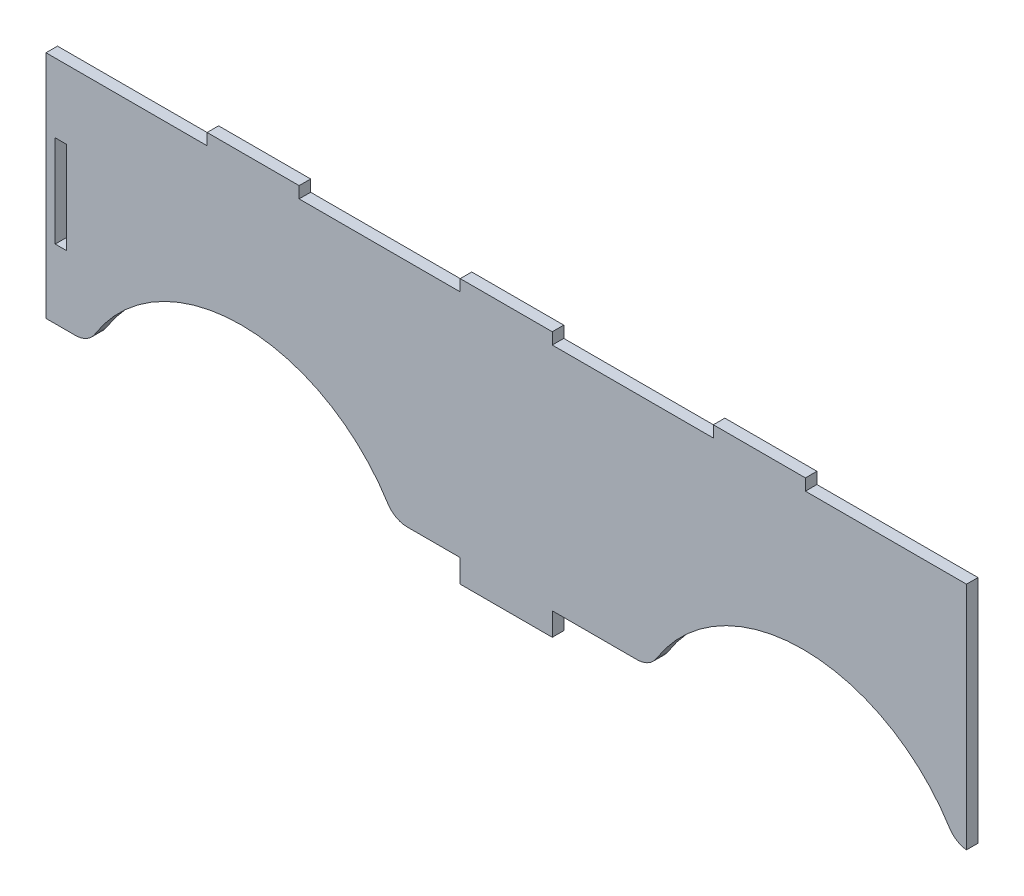
ISO-10303-21;
HEADER;
FILE_DESCRIPTION(('STEP AP214'),'2;1');
FILE_NAME('part.step','',(''),(''),'','','');
FILE_SCHEMA(('AUTOMOTIVE_DESIGN { 1 0 10303 214 1 1 1 1 }'));
ENDSEC;
DATA;
#1=APPLICATION_CONTEXT('core data for automotive mechanical design processes');
#2=APPLICATION_PROTOCOL_DEFINITION('international standard','automotive_design',2000,#1);
#3=PRODUCT_CONTEXT('',#1,'mechanical');
#4=PRODUCT('Part','Part','',(#3));
#5=PRODUCT_RELATED_PRODUCT_CATEGORY('part','',(#4));
#6=PRODUCT_DEFINITION_FORMATION('','',#4);
#7=PRODUCT_DEFINITION_CONTEXT('part definition',#1,'design');
#8=PRODUCT_DEFINITION('design','',#6,#7);
#9=PRODUCT_DEFINITION_SHAPE('','',#8);
#10=(LENGTH_UNIT() NAMED_UNIT(*) SI_UNIT(.MILLI.,.METRE.));
#11=(NAMED_UNIT(*) PLANE_ANGLE_UNIT() SI_UNIT($,.RADIAN.));
#12=(NAMED_UNIT(*) SI_UNIT($,.STERADIAN.) SOLID_ANGLE_UNIT());
#13=UNCERTAINTY_MEASURE_WITH_UNIT(LENGTH_MEASURE(1.E-05),#10,'distance_accuracy_value','');
#14=(GEOMETRIC_REPRESENTATION_CONTEXT(3) GLOBAL_UNCERTAINTY_ASSIGNED_CONTEXT((#13)) GLOBAL_UNIT_ASSIGNED_CONTEXT((#10,
#11,#12)) REPRESENTATION_CONTEXT('',''));
#15=CARTESIAN_POINT('',(0.,0.,0.));
#16=DIRECTION('',(0.,0.,1.));
#17=DIRECTION('',(1.,0.,0.));
#18=AXIS2_PLACEMENT_3D('',#15,#16,#17);
#19=CARTESIAN_POINT('',(64.453752096446,-42.5,1.25));
#20=DIRECTION('',(0.,0.,-1.));
#21=DIRECTION('',(-1.,0.,0.));
#22=AXIS2_PLACEMENT_3D('',#19,#20,#21);
#23=PLANE('',#22);
#24=CARTESIAN_POINT('',(64.453752096446,-42.5,1.25));
#25=DIRECTION('',(0.,0.,-1.));
#26=DIRECTION('',(-1.,0.,0.));
#27=AXIS2_PLACEMENT_3D('',#24,#25,#26);
#28=CIRCLE('',#27,37.5);
#29=CARTESIAN_POINT('',(32.6400643717638,-22.6470588235294,1.25));
#30=VERTEX_POINT('',#29);
#31=CARTESIAN_POINT('',(96.282738613422,-22.6715956945053,1.25));
#32=VERTEX_POINT('',#31);
#33=EDGE_CURVE('E296',#30,#32,#28,.T.);
#34=ORIENTED_EDGE('',*,*,#33,.T.);
#35=CARTESIAN_POINT('',(100.526603482352,-20.0278084537727,1.25));
#36=DIRECTION('',(0.,0.,-1.));
#37=DIRECTION('',(-1.,0.,0.));
#38=AXIS2_PLACEMENT_3D('',#35,#36,#37);
#39=CIRCLE('',#38,5.);
#40=CARTESIAN_POINT('',(100.,-25.,1.25));
#41=VERTEX_POINT('',#40);
#42=EDGE_CURVE('E454',#32,#41,#39,.F.);
#43=ORIENTED_EDGE('',*,*,#42,.T.);
#44=DIRECTION('',(0.,1.,0.));
#45=VECTOR('',#44,1.);
#46=CARTESIAN_POINT('',(100.,-25.,1.25));
#47=LINE('',#46,#45);
#48=CARTESIAN_POINT('',(100.,25.,1.25));
#49=VERTEX_POINT('',#48);
#50=EDGE_CURVE('E299',#41,#49,#47,.T.);
#51=ORIENTED_EDGE('',*,*,#50,.T.);
#52=DIRECTION('',(-1.,0.,0.));
#53=VECTOR('',#52,1.);
#54=CARTESIAN_POINT('',(100.,25.,1.25));
#55=LINE('',#54,#53);
#56=CARTESIAN_POINT('',(65.,25.,1.25));
#57=VERTEX_POINT('',#56);
#58=EDGE_CURVE('E301',#49,#57,#55,.T.);
#59=ORIENTED_EDGE('',*,*,#58,.T.);
#60=DIRECTION('',(0.,1.,0.));
#61=VECTOR('',#60,1.);
#62=CARTESIAN_POINT('',(65.,25.,1.25));
#63=LINE('',#62,#61);
#64=CARTESIAN_POINT('',(65.,27.5,1.25));
#65=VERTEX_POINT('',#64);
#66=EDGE_CURVE('E303',#57,#65,#63,.T.);
#67=ORIENTED_EDGE('',*,*,#66,.T.);
#68=DIRECTION('',(-1.,0.,0.));
#69=VECTOR('',#68,1.);
#70=CARTESIAN_POINT('',(65.,27.5,1.25));
#71=LINE('',#70,#69);
#72=CARTESIAN_POINT('',(45.,27.5,1.25));
#73=VERTEX_POINT('',#72);
#74=EDGE_CURVE('E305',#65,#73,#71,.T.);
#75=ORIENTED_EDGE('',*,*,#74,.T.);
#76=DIRECTION('',(0.,-1.,0.));
#77=VECTOR('',#76,1.);
#78=CARTESIAN_POINT('',(45.,27.5,1.25));
#79=LINE('',#78,#77);
#80=CARTESIAN_POINT('',(45.,25.,1.25));
#81=VERTEX_POINT('',#80);
#82=EDGE_CURVE('E307',#73,#81,#79,.T.);
#83=ORIENTED_EDGE('',*,*,#82,.T.);
#84=DIRECTION('',(-1.,0.,0.));
#85=VECTOR('',#84,1.);
#86=CARTESIAN_POINT('',(45.,25.,1.25));
#87=LINE('',#86,#85);
#88=CARTESIAN_POINT('',(9.99999999999998,25.,1.25));
#89=VERTEX_POINT('',#88);
#90=EDGE_CURVE('E309',#81,#89,#87,.T.);
#91=ORIENTED_EDGE('',*,*,#90,.T.);
#92=DIRECTION('',(0.,1.,0.));
#93=VECTOR('',#92,1.);
#94=CARTESIAN_POINT('',(9.99999999999998,25.,1.25));
#95=LINE('',#94,#93);
#96=CARTESIAN_POINT('',(10.,27.5,1.25));
#97=VERTEX_POINT('',#96);
#98=EDGE_CURVE('E311',#89,#97,#95,.T.);
#99=ORIENTED_EDGE('',*,*,#98,.T.);
#100=DIRECTION('',(-1.,0.,0.));
#101=VECTOR('',#100,1.);
#102=CARTESIAN_POINT('',(-10.,27.5,1.25));
#103=LINE('',#102,#101);
#104=CARTESIAN_POINT('',(-10.,27.5,1.25));
#105=VERTEX_POINT('',#104);
#106=EDGE_CURVE('E313',#97,#105,#103,.T.);
#107=ORIENTED_EDGE('',*,*,#106,.T.);
#108=DIRECTION('',(0.,-1.,0.));
#109=VECTOR('',#108,1.);
#110=CARTESIAN_POINT('',(-9.99999999999998,25.,1.25));
#111=LINE('',#110,#109);
#112=CARTESIAN_POINT('',(-9.99999999999998,25.,1.25));
#113=VERTEX_POINT('',#112);
#114=EDGE_CURVE('E315',#105,#113,#111,.T.);
#115=ORIENTED_EDGE('',*,*,#114,.T.);
#116=DIRECTION('',(-1.,0.,0.));
#117=VECTOR('',#116,1.);
#118=CARTESIAN_POINT('',(-45.,25.,1.25));
#119=LINE('',#118,#117);
#120=CARTESIAN_POINT('',(-45.,25.,1.25));
#121=VERTEX_POINT('',#120);
#122=EDGE_CURVE('E317',#113,#121,#119,.T.);
#123=ORIENTED_EDGE('',*,*,#122,.T.);
#124=DIRECTION('',(0.,1.,0.));
#125=VECTOR('',#124,1.);
#126=CARTESIAN_POINT('',(-45.,27.5,1.25));
#127=LINE('',#126,#125);
#128=CARTESIAN_POINT('',(-45.,27.5,1.25));
#129=VERTEX_POINT('',#128);
#130=EDGE_CURVE('E319',#121,#129,#127,.T.);
#131=ORIENTED_EDGE('',*,*,#130,.T.);
#132=DIRECTION('',(-1.,0.,0.));
#133=VECTOR('',#132,1.);
#134=CARTESIAN_POINT('',(-65.,27.5,1.25));
#135=LINE('',#134,#133);
#136=CARTESIAN_POINT('',(-65.,27.5,1.25));
#137=VERTEX_POINT('',#136);
#138=EDGE_CURVE('E321',#129,#137,#135,.T.);
#139=ORIENTED_EDGE('',*,*,#138,.T.);
#140=DIRECTION('',(0.,-1.,0.));
#141=VECTOR('',#140,1.);
#142=CARTESIAN_POINT('',(-65.,25.,1.25));
#143=LINE('',#142,#141);
#144=CARTESIAN_POINT('',(-65.,25.,1.25));
#145=VERTEX_POINT('',#144);
#146=EDGE_CURVE('E323',#137,#145,#143,.T.);
#147=ORIENTED_EDGE('',*,*,#146,.T.);
#148=DIRECTION('',(-1.,0.,0.));
#149=VECTOR('',#148,1.);
#150=CARTESIAN_POINT('',(-100.,25.,1.25));
#151=LINE('',#150,#149);
#152=CARTESIAN_POINT('',(-100.,25.,1.25));
#153=VERTEX_POINT('',#152);
#154=EDGE_CURVE('E325',#145,#153,#151,.T.);
#155=ORIENTED_EDGE('',*,*,#154,.T.);
#156=DIRECTION('',(0.,-1.,0.));
#157=VECTOR('',#156,1.);
#158=CARTESIAN_POINT('',(-100.,-25.,1.25));
#159=LINE('',#158,#157);
#160=CARTESIAN_POINT('',(-100.,-25.,1.25));
#161=VERTEX_POINT('',#160);
#162=EDGE_CURVE('E327',#153,#161,#159,.T.);
#163=ORIENTED_EDGE('',*,*,#162,.T.);
#164=DIRECTION('',(1.,0.,0.));
#165=VECTOR('',#164,1.);
#166=CARTESIAN_POINT('',(-90.74,-25.,1.25));
#167=LINE('',#166,#165);
#168=CARTESIAN_POINT('',(-93.6292648510859,-25.,1.25));
#169=VERTEX_POINT('',#168);
#170=EDGE_CURVE('E280',#161,#169,#167,.T.);
#171=ORIENTED_EDGE('',*,*,#170,.T.);
#172=CARTESIAN_POINT('',(-93.6292648510859,-20.,1.25));
#173=DIRECTION('',(0.,0.,-1.));
#174=DIRECTION('',(-1.,0.,0.));
#175=AXIS2_PLACEMENT_3D('',#172,#173,#174);
#176=CIRCLE('',#175,5.);
#177=CARTESIAN_POINT('',(-89.3874398211283,-22.6470588235294,1.25));
#178=VERTEX_POINT('',#177);
#179=EDGE_CURVE('E449',#169,#178,#176,.F.);
#180=ORIENTED_EDGE('',*,*,#179,.T.);
#181=CARTESIAN_POINT('',(-57.573752096446,-42.5,1.25));
#182=DIRECTION('',(0.,0.,-1.));
#183=DIRECTION('',(-1.,0.,0.));
#184=AXIS2_PLACEMENT_3D('',#181,#182,#183);
#185=CIRCLE('',#184,37.5);
#186=CARTESIAN_POINT('',(-25.7600643717638,-22.6470588235294,1.25));
#187=VERTEX_POINT('',#186);
#188=EDGE_CURVE('E283',#178,#187,#185,.T.);
#189=ORIENTED_EDGE('',*,*,#188,.T.);
#190=CARTESIAN_POINT('',(-21.5182393418061,-20.,1.25));
#191=DIRECTION('',(0.,0.,-1.));
#192=DIRECTION('',(-1.,0.,0.));
#193=AXIS2_PLACEMENT_3D('',#190,#191,#192);
#194=CIRCLE('',#193,5.);
#195=CARTESIAN_POINT('',(-21.5182393418061,-25.,1.25));
#196=VERTEX_POINT('',#195);
#197=EDGE_CURVE('E56',#187,#196,#194,.F.);
#198=ORIENTED_EDGE('',*,*,#197,.T.);
#199=DIRECTION('',(1.,0.,0.));
#200=VECTOR('',#199,1.);
#201=CARTESIAN_POINT('',(-10.,-25.,1.25));
#202=LINE('',#201,#200);
#203=CARTESIAN_POINT('',(-10.,-25.,1.25));
#204=VERTEX_POINT('',#203);
#205=EDGE_CURVE('E286',#196,#204,#202,.T.);
#206=ORIENTED_EDGE('',*,*,#205,.T.);
#207=DIRECTION('',(0.,-1.,0.));
#208=VECTOR('',#207,1.);
#209=CARTESIAN_POINT('',(-10.,-25.,1.25));
#210=LINE('',#209,#208);
#211=CARTESIAN_POINT('',(-10.,-30.,1.25));
#212=VERTEX_POINT('',#211);
#213=EDGE_CURVE('E288',#204,#212,#210,.T.);
#214=ORIENTED_EDGE('',*,*,#213,.T.);
#215=DIRECTION('',(1.,0.,0.));
#216=VECTOR('',#215,1.);
#217=CARTESIAN_POINT('',(-10.,-30.,1.25));
#218=LINE('',#217,#216);
#219=CARTESIAN_POINT('',(10.,-30.,1.25));
#220=VERTEX_POINT('',#219);
#221=EDGE_CURVE('E290',#212,#220,#218,.T.);
#222=ORIENTED_EDGE('',*,*,#221,.T.);
#223=DIRECTION('',(0.,1.,0.));
#224=VECTOR('',#223,1.);
#225=CARTESIAN_POINT('',(10.,-30.,1.25));
#226=LINE('',#225,#224);
#227=CARTESIAN_POINT('',(10.,-25.,1.25));
#228=VERTEX_POINT('',#227);
#229=EDGE_CURVE('E292',#220,#228,#226,.T.);
#230=ORIENTED_EDGE('',*,*,#229,.T.);
#231=DIRECTION('',(1.,0.,0.));
#232=VECTOR('',#231,1.);
#233=CARTESIAN_POINT('',(31.287504192892,-25.,1.25));
#234=LINE('',#233,#232);
#235=CARTESIAN_POINT('',(28.3982393418061,-25.,1.25));
#236=VERTEX_POINT('',#235);
#237=EDGE_CURVE('E294',#228,#236,#234,.T.);
#238=ORIENTED_EDGE('',*,*,#237,.T.);
#239=CARTESIAN_POINT('',(28.3982393418061,-20.,1.25));
#240=DIRECTION('',(0.,0.,-1.));
#241=DIRECTION('',(-1.,0.,0.));
#242=AXIS2_PLACEMENT_3D('',#239,#240,#241);
#243=CIRCLE('',#242,5.);
#244=EDGE_CURVE('E452',#236,#30,#243,.F.);
#245=ORIENTED_EDGE('',*,*,#244,.T.);
#246=EDGE_LOOP('',(#34,#43,#51,#59,#67,#75,#83,#91,#99,#107,#115,#123,#131,#139,#147,#155,#163,
#171,#180,#189,#198,#206,#214,#222,#230,#238,#245));
#247=FACE_BOUND('',#246,.T.);
#248=DIRECTION('',(0.,1.,0.));
#249=VECTOR('',#248,1.);
#250=CARTESIAN_POINT('',(-95.5,-10.,1.25));
#251=LINE('',#250,#249);
#252=CARTESIAN_POINT('',(-95.5,-10.,1.25));
#253=VERTEX_POINT('',#252);
#254=CARTESIAN_POINT('',(-95.5,10.,1.25));
#255=VERTEX_POINT('',#254);
#256=EDGE_CURVE('E239',#253,#255,#251,.T.);
#257=ORIENTED_EDGE('',*,*,#256,.F.);
#258=DIRECTION('',(1.,0.,0.));
#259=VECTOR('',#258,1.);
#260=CARTESIAN_POINT('',(-98.,-10.,1.25));
#261=LINE('',#260,#259);
#262=CARTESIAN_POINT('',(-98.,-9.99999999999999,1.25));
#263=VERTEX_POINT('',#262);
#264=EDGE_CURVE('E264',#263,#253,#261,.T.);
#265=ORIENTED_EDGE('',*,*,#264,.F.);
#266=DIRECTION('',(0.,-1.,0.));
#267=VECTOR('',#266,1.);
#268=CARTESIAN_POINT('',(-98.,-10.,1.25));
#269=LINE('',#268,#267);
#270=CARTESIAN_POINT('',(-98.,10.,1.25));
#271=VERTEX_POINT('',#270);
#272=EDGE_CURVE('E262',#271,#263,#269,.T.);
#273=ORIENTED_EDGE('',*,*,#272,.F.);
#274=DIRECTION('',(-1.,0.,0.));
#275=VECTOR('',#274,1.);
#276=CARTESIAN_POINT('',(-98.,10.,1.25));
#277=LINE('',#276,#275);
#278=EDGE_CURVE('E249',#255,#271,#277,.T.);
#279=ORIENTED_EDGE('',*,*,#278,.F.);
#280=EDGE_LOOP('',(#257,#265,#273,#279));
#281=FACE_BOUND('',#280,.T.);
#282=ADVANCED_FACE('F33',(#247,#281),#23,.F.);
#283=CARTESIAN_POINT('',(64.453752096446,-42.5,-1.25));
#284=DIRECTION('',(0.,0.,-1.));
#285=DIRECTION('',(-1.,0.,0.));
#286=AXIS2_PLACEMENT_3D('',#283,#284,#285);
#287=PLANE('',#286);
#288=DIRECTION('',(0.,1.,0.));
#289=VECTOR('',#288,1.);
#290=CARTESIAN_POINT('',(100.,-25.,-1.25));
#291=LINE('',#290,#289);
#292=CARTESIAN_POINT('',(100.,-25.,-1.25));
#293=VERTEX_POINT('',#292);
#294=CARTESIAN_POINT('',(100.,25.,-1.25));
#295=VERTEX_POINT('',#294);
#296=EDGE_CURVE('E348',#293,#295,#291,.T.);
#297=ORIENTED_EDGE('',*,*,#296,.F.);
#298=CARTESIAN_POINT('',(100.526603482352,-20.0278084537727,-1.25));
#299=DIRECTION('',(0.,0.,-1.));
#300=DIRECTION('',(-1.,0.,0.));
#301=AXIS2_PLACEMENT_3D('',#298,#299,#300);
#302=CIRCLE('',#301,5.);
#303=CARTESIAN_POINT('',(96.282738613422,-22.6715956945053,-1.25));
#304=VERTEX_POINT('',#303);
#305=EDGE_CURVE('E442',#293,#304,#302,.T.);
#306=ORIENTED_EDGE('',*,*,#305,.T.);
#307=CARTESIAN_POINT('',(64.453752096446,-42.5,-1.25));
#308=DIRECTION('',(0.,0.,-1.));
#309=DIRECTION('',(-1.,0.,0.));
#310=AXIS2_PLACEMENT_3D('',#307,#308,#309);
#311=CIRCLE('',#310,37.5);
#312=CARTESIAN_POINT('',(32.6400643717638,-22.6470588235294,-1.25));
#313=VERTEX_POINT('',#312);
#314=EDGE_CURVE('E345',#313,#304,#311,.T.);
#315=ORIENTED_EDGE('',*,*,#314,.F.);
#316=CARTESIAN_POINT('',(28.3982393418061,-20.,-1.25));
#317=DIRECTION('',(0.,0.,-1.));
#318=DIRECTION('',(-1.,0.,0.));
#319=AXIS2_PLACEMENT_3D('',#316,#317,#318);
#320=CIRCLE('',#319,5.);
#321=CARTESIAN_POINT('',(28.3982393418061,-25.,-1.25));
#322=VERTEX_POINT('',#321);
#323=EDGE_CURVE('E440',#313,#322,#320,.T.);
#324=ORIENTED_EDGE('',*,*,#323,.T.);
#325=DIRECTION('',(1.,0.,0.));
#326=VECTOR('',#325,1.);
#327=CARTESIAN_POINT('',(31.287504192892,-25.,-1.25));
#328=LINE('',#327,#326);
#329=CARTESIAN_POINT('',(10.,-25.,-1.25));
#330=VERTEX_POINT('',#329);
#331=EDGE_CURVE('E343',#330,#322,#328,.T.);
#332=ORIENTED_EDGE('',*,*,#331,.F.);
#333=DIRECTION('',(0.,1.,0.));
#334=VECTOR('',#333,1.);
#335=CARTESIAN_POINT('',(10.,-30.,-1.25));
#336=LINE('',#335,#334);
#337=CARTESIAN_POINT('',(10.,-30.,-1.25));
#338=VERTEX_POINT('',#337);
#339=EDGE_CURVE('E341',#338,#330,#336,.T.);
#340=ORIENTED_EDGE('',*,*,#339,.F.);
#341=DIRECTION('',(1.,0.,0.));
#342=VECTOR('',#341,1.);
#343=CARTESIAN_POINT('',(-10.,-30.,-1.25));
#344=LINE('',#343,#342);
#345=CARTESIAN_POINT('',(-10.,-30.,-1.25));
#346=VERTEX_POINT('',#345);
#347=EDGE_CURVE('E339',#346,#338,#344,.T.);
#348=ORIENTED_EDGE('',*,*,#347,.F.);
#349=DIRECTION('',(0.,-1.,0.));
#350=VECTOR('',#349,1.);
#351=CARTESIAN_POINT('',(-10.,-25.,-1.25));
#352=LINE('',#351,#350);
#353=CARTESIAN_POINT('',(-10.,-25.,-1.25));
#354=VERTEX_POINT('',#353);
#355=EDGE_CURVE('E337',#354,#346,#352,.T.);
#356=ORIENTED_EDGE('',*,*,#355,.F.);
#357=DIRECTION('',(1.,0.,0.));
#358=VECTOR('',#357,1.);
#359=CARTESIAN_POINT('',(-10.,-25.,-1.25));
#360=LINE('',#359,#358);
#361=CARTESIAN_POINT('',(-21.5182393418061,-25.,-1.25));
#362=VERTEX_POINT('',#361);
#363=EDGE_CURVE('E335',#362,#354,#360,.T.);
#364=ORIENTED_EDGE('',*,*,#363,.F.);
#365=CARTESIAN_POINT('',(-21.5182393418061,-20.,-1.25));
#366=DIRECTION('',(0.,0.,-1.));
#367=DIRECTION('',(-1.,0.,0.));
#368=AXIS2_PLACEMENT_3D('',#365,#366,#367);
#369=CIRCLE('',#368,5.);
#370=CARTESIAN_POINT('',(-25.7600643717638,-22.6470588235294,-1.25));
#371=VERTEX_POINT('',#370);
#372=EDGE_CURVE('E438',#362,#371,#369,.T.);
#373=ORIENTED_EDGE('',*,*,#372,.T.);
#374=CARTESIAN_POINT('',(-57.573752096446,-42.5,-1.25));
#375=DIRECTION('',(0.,0.,-1.));
#376=DIRECTION('',(-1.,0.,0.));
#377=AXIS2_PLACEMENT_3D('',#374,#375,#376);
#378=CIRCLE('',#377,37.5);
#379=CARTESIAN_POINT('',(-89.3874398211283,-22.6470588235294,-1.25));
#380=VERTEX_POINT('',#379);
#381=EDGE_CURVE('E332',#380,#371,#378,.T.);
#382=ORIENTED_EDGE('',*,*,#381,.F.);
#383=CARTESIAN_POINT('',(-93.6292648510859,-20.,-1.25));
#384=DIRECTION('',(0.,0.,-1.));
#385=DIRECTION('',(-1.,0.,0.));
#386=AXIS2_PLACEMENT_3D('',#383,#384,#385);
#387=CIRCLE('',#386,5.);
#388=CARTESIAN_POINT('',(-93.6292648510859,-25.,-1.25));
#389=VERTEX_POINT('',#388);
#390=EDGE_CURVE('E436',#380,#389,#387,.T.);
#391=ORIENTED_EDGE('',*,*,#390,.T.);
#392=DIRECTION('',(1.,0.,0.));
#393=VECTOR('',#392,1.);
#394=CARTESIAN_POINT('',(-90.74,-25.,-1.25));
#395=LINE('',#394,#393);
#396=CARTESIAN_POINT('',(-100.,-25.,-1.25));
#397=VERTEX_POINT('',#396);
#398=EDGE_CURVE('E257',#397,#389,#395,.T.);
#399=ORIENTED_EDGE('',*,*,#398,.F.);
#400=DIRECTION('',(0.,-1.,0.));
#401=VECTOR('',#400,1.);
#402=CARTESIAN_POINT('',(-100.,-25.,-1.25));
#403=LINE('',#402,#401);
#404=CARTESIAN_POINT('',(-100.,25.,-1.25));
#405=VERTEX_POINT('',#404);
#406=EDGE_CURVE('E284',#405,#397,#403,.T.);
#407=ORIENTED_EDGE('',*,*,#406,.F.);
#408=DIRECTION('',(-1.,0.,0.));
#409=VECTOR('',#408,1.);
#410=CARTESIAN_POINT('',(-100.,25.,-1.25));
#411=LINE('',#410,#409);
#412=CARTESIAN_POINT('',(-65.,25.,-1.25));
#413=VERTEX_POINT('',#412);
#414=EDGE_CURVE('E374',#413,#405,#411,.T.);
#415=ORIENTED_EDGE('',*,*,#414,.F.);
#416=DIRECTION('',(0.,-1.,0.));
#417=VECTOR('',#416,1.);
#418=CARTESIAN_POINT('',(-65.,25.,-1.25));
#419=LINE('',#418,#417);
#420=CARTESIAN_POINT('',(-65.,27.5,-1.25));
#421=VERTEX_POINT('',#420);
#422=EDGE_CURVE('E372',#421,#413,#419,.T.);
#423=ORIENTED_EDGE('',*,*,#422,.F.);
#424=DIRECTION('',(-1.,0.,0.));
#425=VECTOR('',#424,1.);
#426=CARTESIAN_POINT('',(-65.,27.5,-1.25));
#427=LINE('',#426,#425);
#428=CARTESIAN_POINT('',(-45.,27.5,-1.25));
#429=VERTEX_POINT('',#428);
#430=EDGE_CURVE('E370',#429,#421,#427,.T.);
#431=ORIENTED_EDGE('',*,*,#430,.F.);
#432=DIRECTION('',(0.,1.,0.));
#433=VECTOR('',#432,1.);
#434=CARTESIAN_POINT('',(-45.,27.5,-1.25));
#435=LINE('',#434,#433);
#436=CARTESIAN_POINT('',(-45.,25.,-1.25));
#437=VERTEX_POINT('',#436);
#438=EDGE_CURVE('E368',#437,#429,#435,.T.);
#439=ORIENTED_EDGE('',*,*,#438,.F.);
#440=DIRECTION('',(-1.,0.,0.));
#441=VECTOR('',#440,1.);
#442=CARTESIAN_POINT('',(-45.,25.,-1.25));
#443=LINE('',#442,#441);
#444=CARTESIAN_POINT('',(-9.99999999999998,25.,-1.25));
#445=VERTEX_POINT('',#444);
#446=EDGE_CURVE('E366',#445,#437,#443,.T.);
#447=ORIENTED_EDGE('',*,*,#446,.F.);
#448=DIRECTION('',(0.,-1.,0.));
#449=VECTOR('',#448,1.);
#450=CARTESIAN_POINT('',(-9.99999999999998,25.,-1.25));
#451=LINE('',#450,#449);
#452=CARTESIAN_POINT('',(-10.,27.5,-1.25));
#453=VERTEX_POINT('',#452);
#454=EDGE_CURVE('E364',#453,#445,#451,.T.);
#455=ORIENTED_EDGE('',*,*,#454,.F.);
#456=DIRECTION('',(-1.,0.,0.));
#457=VECTOR('',#456,1.);
#458=CARTESIAN_POINT('',(-10.,27.5,-1.25));
#459=LINE('',#458,#457);
#460=CARTESIAN_POINT('',(10.,27.5,-1.25));
#461=VERTEX_POINT('',#460);
#462=EDGE_CURVE('E362',#461,#453,#459,.T.);
#463=ORIENTED_EDGE('',*,*,#462,.F.);
#464=DIRECTION('',(0.,1.,0.));
#465=VECTOR('',#464,1.);
#466=CARTESIAN_POINT('',(9.99999999999998,25.,-1.25));
#467=LINE('',#466,#465);
#468=CARTESIAN_POINT('',(9.99999999999998,25.,-1.25));
#469=VERTEX_POINT('',#468);
#470=EDGE_CURVE('E360',#469,#461,#467,.T.);
#471=ORIENTED_EDGE('',*,*,#470,.F.);
#472=DIRECTION('',(-1.,0.,0.));
#473=VECTOR('',#472,1.);
#474=CARTESIAN_POINT('',(45.,25.,-1.25));
#475=LINE('',#474,#473);
#476=CARTESIAN_POINT('',(45.,25.,-1.25));
#477=VERTEX_POINT('',#476);
#478=EDGE_CURVE('E358',#477,#469,#475,.T.);
#479=ORIENTED_EDGE('',*,*,#478,.F.);
#480=DIRECTION('',(0.,-1.,0.));
#481=VECTOR('',#480,1.);
#482=CARTESIAN_POINT('',(45.,27.5,-1.25));
#483=LINE('',#482,#481);
#484=CARTESIAN_POINT('',(45.,27.5,-1.25));
#485=VERTEX_POINT('',#484);
#486=EDGE_CURVE('E356',#485,#477,#483,.T.);
#487=ORIENTED_EDGE('',*,*,#486,.F.);
#488=DIRECTION('',(-1.,0.,0.));
#489=VECTOR('',#488,1.);
#490=CARTESIAN_POINT('',(65.,27.5,-1.25));
#491=LINE('',#490,#489);
#492=CARTESIAN_POINT('',(65.,27.5,-1.25));
#493=VERTEX_POINT('',#492);
#494=EDGE_CURVE('E354',#493,#485,#491,.T.);
#495=ORIENTED_EDGE('',*,*,#494,.F.);
#496=DIRECTION('',(0.,1.,0.));
#497=VECTOR('',#496,1.);
#498=CARTESIAN_POINT('',(65.,25.,-1.25));
#499=LINE('',#498,#497);
#500=CARTESIAN_POINT('',(65.,25.,-1.25));
#501=VERTEX_POINT('',#500);
#502=EDGE_CURVE('E352',#501,#493,#499,.T.);
#503=ORIENTED_EDGE('',*,*,#502,.F.);
#504=DIRECTION('',(-1.,0.,0.));
#505=VECTOR('',#504,1.);
#506=CARTESIAN_POINT('',(100.,25.,-1.25));
#507=LINE('',#506,#505);
#508=EDGE_CURVE('E350',#295,#501,#507,.T.);
#509=ORIENTED_EDGE('',*,*,#508,.F.);
#510=EDGE_LOOP('',(#297,#306,#315,#324,#332,#340,#348,#356,#364,#373,#382,#391,#399,#407,#415,
#423,#431,#439,#447,#455,#463,#471,#479,#487,#495,#503,#509));
#511=FACE_BOUND('',#510,.T.);
#512=DIRECTION('',(1.,0.,0.));
#513=VECTOR('',#512,1.);
#514=CARTESIAN_POINT('',(-98.,-10.,-1.25));
#515=LINE('',#514,#513);
#516=CARTESIAN_POINT('',(-98.,-10.,-1.25));
#517=VERTEX_POINT('',#516);
#518=CARTESIAN_POINT('',(-95.5,-9.99999999999999,-1.25));
#519=VERTEX_POINT('',#518);
#520=EDGE_CURVE('E250',#517,#519,#515,.T.);
#521=ORIENTED_EDGE('',*,*,#520,.T.);
#522=DIRECTION('',(0.,1.,0.));
#523=VECTOR('',#522,1.);
#524=CARTESIAN_POINT('',(-95.5,-10.,-1.25));
#525=LINE('',#524,#523);
#526=CARTESIAN_POINT('',(-95.5,10.,-1.25));
#527=VERTEX_POINT('',#526);
#528=EDGE_CURVE('E268',#519,#527,#525,.T.);
#529=ORIENTED_EDGE('',*,*,#528,.T.);
#530=DIRECTION('',(-1.,0.,0.));
#531=VECTOR('',#530,1.);
#532=CARTESIAN_POINT('',(-98.,10.,-1.25));
#533=LINE('',#532,#531);
#534=CARTESIAN_POINT('',(-98.,10.,-1.25));
#535=VERTEX_POINT('',#534);
#536=EDGE_CURVE('E256',#527,#535,#533,.T.);
#537=ORIENTED_EDGE('',*,*,#536,.T.);
#538=DIRECTION('',(0.,-1.,0.));
#539=VECTOR('',#538,1.);
#540=CARTESIAN_POINT('',(-98.,-10.,-1.25));
#541=LINE('',#540,#539);
#542=EDGE_CURVE('E271',#535,#517,#541,.T.);
#543=ORIENTED_EDGE('',*,*,#542,.T.);
#544=EDGE_LOOP('',(#521,#529,#537,#543));
#545=FACE_BOUND('',#544,.T.);
#546=ADVANCED_FACE('F479',(#511,#545),#287,.T.);
#547=CARTESIAN_POINT('',(-90.74,-25.,1.25));
#548=DIRECTION('',(0.,1.,0.));
#549=DIRECTION('',(0.,0.,1.));
#550=AXIS2_PLACEMENT_3D('',#547,#548,#549);
#551=PLANE('',#550);
#552=ORIENTED_EDGE('',*,*,#398,.T.);
#553=DIRECTION('',(0.,0.,-1.));
#554=VECTOR('',#553,1.);
#555=CARTESIAN_POINT('',(-93.6292648510859,-25.,1.25));
#556=LINE('',#555,#554);
#557=EDGE_CURVE('E11',#389,#169,#556,.F.);
#558=ORIENTED_EDGE('',*,*,#557,.T.);
#559=ORIENTED_EDGE('',*,*,#170,.F.);
#560=DIRECTION('',(0.,0.,-1.));
#561=VECTOR('',#560,1.);
#562=CARTESIAN_POINT('',(-100.,-25.,1.25));
#563=LINE('',#562,#561);
#564=EDGE_CURVE('E329',#161,#397,#563,.T.);
#565=ORIENTED_EDGE('',*,*,#564,.T.);
#566=EDGE_LOOP('',(#552,#558,#559,#565));
#567=FACE_BOUND('',#566,.T.);
#568=ADVANCED_FACE('F514',(#567),#551,.F.);
#569=CARTESIAN_POINT('',(-57.573752096446,-42.5,1.25));
#570=DIRECTION('',(0.,0.,-1.));
#571=DIRECTION('',(-1.,0.,0.));
#572=AXIS2_PLACEMENT_3D('',#569,#570,#571);
#573=CYLINDRICAL_SURFACE('',#572,37.5);
#574=ORIENTED_EDGE('',*,*,#381,.T.);
#575=DIRECTION('',(0.,0.,-1.));
#576=VECTOR('',#575,1.);
#577=CARTESIAN_POINT('',(-25.7600643717638,-22.6470588235294,1.25));
#578=LINE('',#577,#576);
#579=EDGE_CURVE('E41',#371,#187,#578,.F.);
#580=ORIENTED_EDGE('',*,*,#579,.T.);
#581=ORIENTED_EDGE('',*,*,#188,.F.);
#582=DIRECTION('',(0.,0.,-1.));
#583=VECTOR('',#582,1.);
#584=CARTESIAN_POINT('',(-89.3874398211283,-22.6470588235294,1.25));
#585=LINE('',#584,#583);
#586=EDGE_CURVE('E460',#178,#380,#585,.T.);
#587=ORIENTED_EDGE('',*,*,#586,.T.);
#588=EDGE_LOOP('',(#574,#580,#581,#587));
#589=FACE_BOUND('',#588,.T.);
#590=ADVANCED_FACE('F465',(#589),#573,.F.);
#591=CARTESIAN_POINT('',(-10.,-25.,1.25));
#592=DIRECTION('',(0.,1.,0.));
#593=DIRECTION('',(-1.,0.,0.));
#594=AXIS2_PLACEMENT_3D('',#591,#592,#593);
#595=PLANE('',#594);
#596=ORIENTED_EDGE('',*,*,#205,.F.);
#597=DIRECTION('',(0.,0.,-1.));
#598=VECTOR('',#597,1.);
#599=CARTESIAN_POINT('',(-21.5182393418061,-25.,1.25));
#600=LINE('',#599,#598);
#601=EDGE_CURVE('E457',#196,#362,#600,.T.);
#602=ORIENTED_EDGE('',*,*,#601,.T.);
#603=ORIENTED_EDGE('',*,*,#363,.T.);
#604=DIRECTION('',(0.,0.,-1.));
#605=VECTOR('',#604,1.);
#606=CARTESIAN_POINT('',(-10.,-25.,1.25));
#607=LINE('',#606,#605);
#608=EDGE_CURVE('E433',#204,#354,#607,.T.);
#609=ORIENTED_EDGE('',*,*,#608,.F.);
#610=EDGE_LOOP('',(#596,#602,#603,#609));
#611=FACE_BOUND('',#610,.T.);
#612=ADVANCED_FACE('F474',(#611),#595,.F.);
#613=CARTESIAN_POINT('',(-10.,-25.,1.25));
#614=DIRECTION('',(1.,0.,0.));
#615=DIRECTION('',(0.,0.,-1.));
#616=AXIS2_PLACEMENT_3D('',#613,#614,#615);
#617=PLANE('',#616);
#618=ORIENTED_EDGE('',*,*,#355,.T.);
#619=DIRECTION('',(0.,0.,-1.));
#620=VECTOR('',#619,1.);
#621=CARTESIAN_POINT('',(-10.,-30.,1.25));
#622=LINE('',#621,#620);
#623=EDGE_CURVE('E430',#212,#346,#622,.T.);
#624=ORIENTED_EDGE('',*,*,#623,.F.);
#625=ORIENTED_EDGE('',*,*,#213,.F.);
#626=ORIENTED_EDGE('',*,*,#608,.T.);
#627=EDGE_LOOP('',(#618,#624,#625,#626));
#628=FACE_BOUND('',#627,.T.);
#629=ADVANCED_FACE('F485',(#628),#617,.F.);
#630=CARTESIAN_POINT('',(-10.,-30.,1.25));
#631=DIRECTION('',(0.,1.,0.));
#632=DIRECTION('',(0.,0.,1.));
#633=AXIS2_PLACEMENT_3D('',#630,#631,#632);
#634=PLANE('',#633);
#635=ORIENTED_EDGE('',*,*,#347,.T.);
#636=DIRECTION('',(0.,0.,-1.));
#637=VECTOR('',#636,1.);
#638=CARTESIAN_POINT('',(10.,-30.,1.25));
#639=LINE('',#638,#637);
#640=EDGE_CURVE('E427',#220,#338,#639,.T.);
#641=ORIENTED_EDGE('',*,*,#640,.F.);
#642=ORIENTED_EDGE('',*,*,#221,.F.);
#643=ORIENTED_EDGE('',*,*,#623,.T.);
#644=EDGE_LOOP('',(#635,#641,#642,#643));
#645=FACE_BOUND('',#644,.T.);
#646=ADVANCED_FACE('F489',(#645),#634,.F.);
#647=CARTESIAN_POINT('',(10.,-30.,1.25));
#648=DIRECTION('',(-1.,0.,0.));
#649=DIRECTION('',(0.,0.,1.));
#650=AXIS2_PLACEMENT_3D('',#647,#648,#649);
#651=PLANE('',#650);
#652=ORIENTED_EDGE('',*,*,#339,.T.);
#653=DIRECTION('',(0.,0.,-1.));
#654=VECTOR('',#653,1.);
#655=CARTESIAN_POINT('',(10.,-25.,1.25));
#656=LINE('',#655,#654);
#657=EDGE_CURVE('E424',#228,#330,#656,.T.);
#658=ORIENTED_EDGE('',*,*,#657,.F.);
#659=ORIENTED_EDGE('',*,*,#229,.F.);
#660=ORIENTED_EDGE('',*,*,#640,.T.);
#661=EDGE_LOOP('',(#652,#658,#659,#660));
#662=FACE_BOUND('',#661,.T.);
#663=ADVANCED_FACE('F495',(#662),#651,.F.);
#664=CARTESIAN_POINT('',(31.287504192892,-25.,1.25));
#665=DIRECTION('',(0.,1.,0.));
#666=DIRECTION('',(-1.,0.,0.));
#667=AXIS2_PLACEMENT_3D('',#664,#665,#666);
#668=PLANE('',#667);
#669=ORIENTED_EDGE('',*,*,#331,.T.);
#670=DIRECTION('',(0.,0.,-1.));
#671=VECTOR('',#670,1.);
#672=CARTESIAN_POINT('',(28.3982393418061,-25.,1.25));
#673=LINE('',#672,#671);
#674=EDGE_CURVE('E48',#322,#236,#673,.F.);
#675=ORIENTED_EDGE('',*,*,#674,.T.);
#676=ORIENTED_EDGE('',*,*,#237,.F.);
#677=ORIENTED_EDGE('',*,*,#657,.T.);
#678=EDGE_LOOP('',(#669,#675,#676,#677));
#679=FACE_BOUND('',#678,.T.);
#680=ADVANCED_FACE('F497',(#679),#668,.F.);
#681=CARTESIAN_POINT('',(64.453752096446,-42.5,1.25));
#682=DIRECTION('',(0.,0.,-1.));
#683=DIRECTION('',(-1.,0.,0.));
#684=AXIS2_PLACEMENT_3D('',#681,#682,#683);
#685=CYLINDRICAL_SURFACE('',#684,37.5);
#686=ORIENTED_EDGE('',*,*,#314,.T.);
#687=DIRECTION('',(0.,0.,-1.));
#688=VECTOR('',#687,1.);
#689=CARTESIAN_POINT('',(96.282738613422,-22.6715956945053,1.25));
#690=LINE('',#689,#688);
#691=EDGE_CURVE('E447',#304,#32,#690,.F.);
#692=ORIENTED_EDGE('',*,*,#691,.T.);
#693=ORIENTED_EDGE('',*,*,#33,.F.);
#694=DIRECTION('',(0.,0.,-1.));
#695=VECTOR('',#694,1.);
#696=CARTESIAN_POINT('',(32.6400643717638,-22.6470588235294,1.25));
#697=LINE('',#696,#695);
#698=EDGE_CURVE('E444',#30,#313,#697,.T.);
#699=ORIENTED_EDGE('',*,*,#698,.T.);
#700=EDGE_LOOP('',(#686,#692,#693,#699));
#701=FACE_BOUND('',#700,.T.);
#702=ADVANCED_FACE('F499',(#701),#685,.F.);
#703=CARTESIAN_POINT('',(100.,-25.,1.25));
#704=DIRECTION('',(-1.,0.,0.));
#705=DIRECTION('',(0.,0.,1.));
#706=AXIS2_PLACEMENT_3D('',#703,#704,#705);
#707=PLANE('',#706);
#708=ORIENTED_EDGE('',*,*,#296,.T.);
#709=DIRECTION('',(0.,0.,-1.));
#710=VECTOR('',#709,1.);
#711=CARTESIAN_POINT('',(100.,25.,1.25));
#712=LINE('',#711,#710);
#713=EDGE_CURVE('E418',#49,#295,#712,.T.);
#714=ORIENTED_EDGE('',*,*,#713,.F.);
#715=ORIENTED_EDGE('',*,*,#50,.F.);
#716=DIRECTION('',(0.,0.,-1.));
#717=VECTOR('',#716,1.);
#718=CARTESIAN_POINT('',(100.,-25.,1.25));
#719=LINE('',#718,#717);
#720=EDGE_CURVE('E421',#41,#293,#719,.T.);
#721=ORIENTED_EDGE('',*,*,#720,.T.);
#722=EDGE_LOOP('',(#708,#714,#715,#721));
#723=FACE_BOUND('',#722,.T.);
#724=ADVANCED_FACE('F505',(#723),#707,.F.);
#725=CARTESIAN_POINT('',(100.,25.,1.25));
#726=DIRECTION('',(0.,-1.,0.));
#727=DIRECTION('',(0.,0.,-1.));
#728=AXIS2_PLACEMENT_3D('',#725,#726,#727);
#729=PLANE('',#728);
#730=ORIENTED_EDGE('',*,*,#508,.T.);
#731=DIRECTION('',(0.,0.,-1.));
#732=VECTOR('',#731,1.);
#733=CARTESIAN_POINT('',(65.,25.,1.25));
#734=LINE('',#733,#732);
#735=EDGE_CURVE('E415',#57,#501,#734,.T.);
#736=ORIENTED_EDGE('',*,*,#735,.F.);
#737=ORIENTED_EDGE('',*,*,#58,.F.);
#738=ORIENTED_EDGE('',*,*,#713,.T.);
#739=EDGE_LOOP('',(#730,#736,#737,#738));
#740=FACE_BOUND('',#739,.T.);
#741=ADVANCED_FACE('F570',(#740),#729,.F.);
#742=CARTESIAN_POINT('',(65.,25.,1.25));
#743=DIRECTION('',(-1.,0.,0.));
#744=DIRECTION('',(0.,0.,1.));
#745=AXIS2_PLACEMENT_3D('',#742,#743,#744);
#746=PLANE('',#745);
#747=ORIENTED_EDGE('',*,*,#502,.T.);
#748=DIRECTION('',(0.,0.,-1.));
#749=VECTOR('',#748,1.);
#750=CARTESIAN_POINT('',(65.,27.5,1.25));
#751=LINE('',#750,#749);
#752=EDGE_CURVE('E412',#65,#493,#751,.T.);
#753=ORIENTED_EDGE('',*,*,#752,.F.);
#754=ORIENTED_EDGE('',*,*,#66,.F.);
#755=ORIENTED_EDGE('',*,*,#735,.T.);
#756=EDGE_LOOP('',(#747,#753,#754,#755));
#757=FACE_BOUND('',#756,.T.);
#758=ADVANCED_FACE('F566',(#757),#746,.F.);
#759=CARTESIAN_POINT('',(65.,27.5,1.25));
#760=DIRECTION('',(0.,-1.,0.));
#761=DIRECTION('',(0.,0.,-1.));
#762=AXIS2_PLACEMENT_3D('',#759,#760,#761);
#763=PLANE('',#762);
#764=ORIENTED_EDGE('',*,*,#494,.T.);
#765=DIRECTION('',(0.,0.,-1.));
#766=VECTOR('',#765,1.);
#767=CARTESIAN_POINT('',(45.,27.5,1.25));
#768=LINE('',#767,#766);
#769=EDGE_CURVE('E409',#73,#485,#768,.T.);
#770=ORIENTED_EDGE('',*,*,#769,.F.);
#771=ORIENTED_EDGE('',*,*,#74,.F.);
#772=ORIENTED_EDGE('',*,*,#752,.T.);
#773=EDGE_LOOP('',(#764,#770,#771,#772));
#774=FACE_BOUND('',#773,.T.);
#775=ADVANCED_FACE('F562',(#774),#763,.F.);
#776=CARTESIAN_POINT('',(45.,27.5,1.25));
#777=DIRECTION('',(1.,0.,0.));
#778=DIRECTION('',(0.,0.,-1.));
#779=AXIS2_PLACEMENT_3D('',#776,#777,#778);
#780=PLANE('',#779);
#781=ORIENTED_EDGE('',*,*,#486,.T.);
#782=DIRECTION('',(0.,0.,-1.));
#783=VECTOR('',#782,1.);
#784=CARTESIAN_POINT('',(45.,25.,1.25));
#785=LINE('',#784,#783);
#786=EDGE_CURVE('E406',#81,#477,#785,.T.);
#787=ORIENTED_EDGE('',*,*,#786,.F.);
#788=ORIENTED_EDGE('',*,*,#82,.F.);
#789=ORIENTED_EDGE('',*,*,#769,.T.);
#790=EDGE_LOOP('',(#781,#787,#788,#789));
#791=FACE_BOUND('',#790,.T.);
#792=ADVANCED_FACE('F558',(#791),#780,.F.);
#793=CARTESIAN_POINT('',(45.,25.,1.25));
#794=DIRECTION('',(0.,-1.,0.));
#795=DIRECTION('',(1.,0.,0.));
#796=AXIS2_PLACEMENT_3D('',#793,#794,#795);
#797=PLANE('',#796);
#798=ORIENTED_EDGE('',*,*,#478,.T.);
#799=DIRECTION('',(0.,0.,-1.));
#800=VECTOR('',#799,1.);
#801=CARTESIAN_POINT('',(9.99999999999998,25.,1.25));
#802=LINE('',#801,#800);
#803=EDGE_CURVE('E403',#89,#469,#802,.T.);
#804=ORIENTED_EDGE('',*,*,#803,.F.);
#805=ORIENTED_EDGE('',*,*,#90,.F.);
#806=ORIENTED_EDGE('',*,*,#786,.T.);
#807=EDGE_LOOP('',(#798,#804,#805,#806));
#808=FACE_BOUND('',#807,.T.);
#809=ADVANCED_FACE('F554',(#808),#797,.F.);
#810=CARTESIAN_POINT('',(9.99999999999998,25.,1.25));
#811=DIRECTION('',(-1.,0.,0.));
#812=DIRECTION('',(0.,-1.,0.));
#813=AXIS2_PLACEMENT_3D('',#810,#811,#812);
#814=PLANE('',#813);
#815=ORIENTED_EDGE('',*,*,#470,.T.);
#816=DIRECTION('',(0.,0.,-1.));
#817=VECTOR('',#816,1.);
#818=CARTESIAN_POINT('',(10.,27.5,1.25));
#819=LINE('',#818,#817);
#820=EDGE_CURVE('E400',#97,#461,#819,.T.);
#821=ORIENTED_EDGE('',*,*,#820,.F.);
#822=ORIENTED_EDGE('',*,*,#98,.F.);
#823=ORIENTED_EDGE('',*,*,#803,.T.);
#824=EDGE_LOOP('',(#815,#821,#822,#823));
#825=FACE_BOUND('',#824,.T.);
#826=ADVANCED_FACE('F550',(#825),#814,.F.);
#827=CARTESIAN_POINT('',(-10.,27.5,1.25));
#828=DIRECTION('',(0.,-1.,0.));
#829=DIRECTION('',(0.,0.,-1.));
#830=AXIS2_PLACEMENT_3D('',#827,#828,#829);
#831=PLANE('',#830);
#832=ORIENTED_EDGE('',*,*,#462,.T.);
#833=DIRECTION('',(0.,0.,-1.));
#834=VECTOR('',#833,1.);
#835=CARTESIAN_POINT('',(-10.,27.5,1.25));
#836=LINE('',#835,#834);
#837=EDGE_CURVE('E397',#105,#453,#836,.T.);
#838=ORIENTED_EDGE('',*,*,#837,.F.);
#839=ORIENTED_EDGE('',*,*,#106,.F.);
#840=ORIENTED_EDGE('',*,*,#820,.T.);
#841=EDGE_LOOP('',(#832,#838,#839,#840));
#842=FACE_BOUND('',#841,.T.);
#843=ADVANCED_FACE('F546',(#842),#831,.F.);
#844=CARTESIAN_POINT('',(-9.99999999999998,25.,1.25));
#845=DIRECTION('',(1.,0.,0.));
#846=DIRECTION('',(0.,1.,0.));
#847=AXIS2_PLACEMENT_3D('',#844,#845,#846);
#848=PLANE('',#847);
#849=ORIENTED_EDGE('',*,*,#454,.T.);
#850=DIRECTION('',(0.,0.,-1.));
#851=VECTOR('',#850,1.);
#852=CARTESIAN_POINT('',(-9.99999999999998,25.,1.25));
#853=LINE('',#852,#851);
#854=EDGE_CURVE('E394',#113,#445,#853,.T.);
#855=ORIENTED_EDGE('',*,*,#854,.F.);
#856=ORIENTED_EDGE('',*,*,#114,.F.);
#857=ORIENTED_EDGE('',*,*,#837,.T.);
#858=EDGE_LOOP('',(#849,#855,#856,#857));
#859=FACE_BOUND('',#858,.T.);
#860=ADVANCED_FACE('F542',(#859),#848,.F.);
#861=CARTESIAN_POINT('',(-45.,25.,1.25));
#862=DIRECTION('',(0.,-1.,0.));
#863=DIRECTION('',(1.,0.,0.));
#864=AXIS2_PLACEMENT_3D('',#861,#862,#863);
#865=PLANE('',#864);
#866=ORIENTED_EDGE('',*,*,#446,.T.);
#867=DIRECTION('',(0.,0.,-1.));
#868=VECTOR('',#867,1.);
#869=CARTESIAN_POINT('',(-45.,25.,1.25));
#870=LINE('',#869,#868);
#871=EDGE_CURVE('E391',#121,#437,#870,.T.);
#872=ORIENTED_EDGE('',*,*,#871,.F.);
#873=ORIENTED_EDGE('',*,*,#122,.F.);
#874=ORIENTED_EDGE('',*,*,#854,.T.);
#875=EDGE_LOOP('',(#866,#872,#873,#874));
#876=FACE_BOUND('',#875,.T.);
#877=ADVANCED_FACE('F538',(#876),#865,.F.);
#878=CARTESIAN_POINT('',(-45.,27.5,1.25));
#879=DIRECTION('',(-1.,0.,0.));
#880=DIRECTION('',(0.,0.,1.));
#881=AXIS2_PLACEMENT_3D('',#878,#879,#880);
#882=PLANE('',#881);
#883=ORIENTED_EDGE('',*,*,#438,.T.);
#884=DIRECTION('',(0.,0.,-1.));
#885=VECTOR('',#884,1.);
#886=CARTESIAN_POINT('',(-45.,27.5,1.25));
#887=LINE('',#886,#885);
#888=EDGE_CURVE('E388',#129,#429,#887,.T.);
#889=ORIENTED_EDGE('',*,*,#888,.F.);
#890=ORIENTED_EDGE('',*,*,#130,.F.);
#891=ORIENTED_EDGE('',*,*,#871,.T.);
#892=EDGE_LOOP('',(#883,#889,#890,#891));
#893=FACE_BOUND('',#892,.T.);
#894=ADVANCED_FACE('F534',(#893),#882,.F.);
#895=CARTESIAN_POINT('',(-65.,27.5,1.25));
#896=DIRECTION('',(0.,-1.,0.));
#897=DIRECTION('',(0.,0.,-1.));
#898=AXIS2_PLACEMENT_3D('',#895,#896,#897);
#899=PLANE('',#898);
#900=ORIENTED_EDGE('',*,*,#430,.T.);
#901=DIRECTION('',(0.,0.,-1.));
#902=VECTOR('',#901,1.);
#903=CARTESIAN_POINT('',(-65.,27.5,1.25));
#904=LINE('',#903,#902);
#905=EDGE_CURVE('E385',#137,#421,#904,.T.);
#906=ORIENTED_EDGE('',*,*,#905,.F.);
#907=ORIENTED_EDGE('',*,*,#138,.F.);
#908=ORIENTED_EDGE('',*,*,#888,.T.);
#909=EDGE_LOOP('',(#900,#906,#907,#908));
#910=FACE_BOUND('',#909,.T.);
#911=ADVANCED_FACE('F530',(#910),#899,.F.);
#912=CARTESIAN_POINT('',(-65.,25.,1.25));
#913=DIRECTION('',(1.,0.,0.));
#914=DIRECTION('',(0.,0.,-1.));
#915=AXIS2_PLACEMENT_3D('',#912,#913,#914);
#916=PLANE('',#915);
#917=ORIENTED_EDGE('',*,*,#422,.T.);
#918=DIRECTION('',(0.,0.,-1.));
#919=VECTOR('',#918,1.);
#920=CARTESIAN_POINT('',(-65.,25.,1.25));
#921=LINE('',#920,#919);
#922=EDGE_CURVE('E382',#145,#413,#921,.T.);
#923=ORIENTED_EDGE('',*,*,#922,.F.);
#924=ORIENTED_EDGE('',*,*,#146,.F.);
#925=ORIENTED_EDGE('',*,*,#905,.T.);
#926=EDGE_LOOP('',(#917,#923,#924,#925));
#927=FACE_BOUND('',#926,.T.);
#928=ADVANCED_FACE('F526',(#927),#916,.F.);
#929=CARTESIAN_POINT('',(-100.,25.,1.25));
#930=DIRECTION('',(0.,-1.,0.));
#931=DIRECTION('',(0.,0.,-1.));
#932=AXIS2_PLACEMENT_3D('',#929,#930,#931);
#933=PLANE('',#932);
#934=ORIENTED_EDGE('',*,*,#414,.T.);
#935=DIRECTION('',(0.,0.,-1.));
#936=VECTOR('',#935,1.);
#937=CARTESIAN_POINT('',(-100.,25.,1.25));
#938=LINE('',#937,#936);
#939=EDGE_CURVE('E379',#153,#405,#938,.T.);
#940=ORIENTED_EDGE('',*,*,#939,.F.);
#941=ORIENTED_EDGE('',*,*,#154,.F.);
#942=ORIENTED_EDGE('',*,*,#922,.T.);
#943=EDGE_LOOP('',(#934,#940,#941,#942));
#944=FACE_BOUND('',#943,.T.);
#945=ADVANCED_FACE('F522',(#944),#933,.F.);
#946=CARTESIAN_POINT('',(-100.,-25.,1.25));
#947=DIRECTION('',(1.,0.,0.));
#948=DIRECTION('',(0.,0.,-1.));
#949=AXIS2_PLACEMENT_3D('',#946,#947,#948);
#950=PLANE('',#949);
#951=ORIENTED_EDGE('',*,*,#406,.T.);
#952=ORIENTED_EDGE('',*,*,#564,.F.);
#953=ORIENTED_EDGE('',*,*,#162,.F.);
#954=ORIENTED_EDGE('',*,*,#939,.T.);
#955=EDGE_LOOP('',(#951,#952,#953,#954));
#956=FACE_BOUND('',#955,.T.);
#957=ADVANCED_FACE('F519',(#956),#950,.F.);
#958=CARTESIAN_POINT('',(-95.5,-10.,1.25));
#959=DIRECTION('',(-1.,0.,0.));
#960=DIRECTION('',(0.,0.,1.));
#961=AXIS2_PLACEMENT_3D('',#958,#959,#960);
#962=PLANE('',#961);
#963=ORIENTED_EDGE('',*,*,#528,.F.);
#964=DIRECTION('',(0.,0.,-1.));
#965=VECTOR('',#964,1.);
#966=CARTESIAN_POINT('',(-95.5,-10.,1.25));
#967=LINE('',#966,#965);
#968=EDGE_CURVE('E245',#253,#519,#967,.T.);
#969=ORIENTED_EDGE('',*,*,#968,.F.);
#970=ORIENTED_EDGE('',*,*,#256,.T.);
#971=DIRECTION('',(0.,0.,-1.));
#972=VECTOR('',#971,1.);
#973=CARTESIAN_POINT('',(-95.5,10.,1.25));
#974=LINE('',#973,#972);
#975=EDGE_CURVE('E242',#255,#527,#974,.T.);
#976=ORIENTED_EDGE('',*,*,#975,.T.);
#977=EDGE_LOOP('',(#963,#969,#970,#976));
#978=FACE_BOUND('',#977,.T.);
#979=ADVANCED_FACE('F241',(#978),#962,.T.);
#980=CARTESIAN_POINT('',(-98.,10.,1.25));
#981=DIRECTION('',(0.,-1.,0.));
#982=DIRECTION('',(0.,0.,-1.));
#983=AXIS2_PLACEMENT_3D('',#980,#981,#982);
#984=PLANE('',#983);
#985=ORIENTED_EDGE('',*,*,#536,.F.);
#986=ORIENTED_EDGE('',*,*,#975,.F.);
#987=ORIENTED_EDGE('',*,*,#278,.T.);
#988=DIRECTION('',(0.,0.,-1.));
#989=VECTOR('',#988,1.);
#990=CARTESIAN_POINT('',(-98.,10.,1.25));
#991=LINE('',#990,#989);
#992=EDGE_CURVE('E258',#271,#535,#991,.T.);
#993=ORIENTED_EDGE('',*,*,#992,.T.);
#994=EDGE_LOOP('',(#985,#986,#987,#993));
#995=FACE_BOUND('',#994,.T.);
#996=ADVANCED_FACE('F253',(#995),#984,.T.);
#997=CARTESIAN_POINT('',(-98.,-10.,1.25));
#998=DIRECTION('',(1.,0.,0.));
#999=DIRECTION('',(0.,0.,-1.));
#1000=AXIS2_PLACEMENT_3D('',#997,#998,#999);
#1001=PLANE('',#1000);
#1002=ORIENTED_EDGE('',*,*,#542,.F.);
#1003=ORIENTED_EDGE('',*,*,#992,.F.);
#1004=ORIENTED_EDGE('',*,*,#272,.T.);
#1005=DIRECTION('',(0.,0.,-1.));
#1006=VECTOR('',#1005,1.);
#1007=CARTESIAN_POINT('',(-98.,-10.,1.25));
#1008=LINE('',#1007,#1006);
#1009=EDGE_CURVE('E277',#263,#517,#1008,.T.);
#1010=ORIENTED_EDGE('',*,*,#1009,.T.);
#1011=EDGE_LOOP('',(#1002,#1003,#1004,#1010));
#1012=FACE_BOUND('',#1011,.T.);
#1013=ADVANCED_FACE('F732',(#1012),#1001,.T.);
#1014=CARTESIAN_POINT('',(-98.,-10.,1.25));
#1015=DIRECTION('',(0.,1.,0.));
#1016=DIRECTION('',(0.,0.,1.));
#1017=AXIS2_PLACEMENT_3D('',#1014,#1015,#1016);
#1018=PLANE('',#1017);
#1019=ORIENTED_EDGE('',*,*,#520,.F.);
#1020=ORIENTED_EDGE('',*,*,#1009,.F.);
#1021=ORIENTED_EDGE('',*,*,#264,.T.);
#1022=ORIENTED_EDGE('',*,*,#968,.T.);
#1023=EDGE_LOOP('',(#1019,#1020,#1021,#1022));
#1024=FACE_BOUND('',#1023,.T.);
#1025=ADVANCED_FACE('F609',(#1024),#1018,.T.);
#1026=CARTESIAN_POINT('',(100.526603482352,-20.0278084537727,1.25));
#1027=DIRECTION('',(0.,0.,-1.));
#1028=DIRECTION('',(-1.,0.,0.));
#1029=AXIS2_PLACEMENT_3D('',#1026,#1027,#1028);
#1030=CYLINDRICAL_SURFACE('',#1029,5.);
#1031=ORIENTED_EDGE('',*,*,#42,.F.);
#1032=ORIENTED_EDGE('',*,*,#691,.F.);
#1033=ORIENTED_EDGE('',*,*,#305,.F.);
#1034=ORIENTED_EDGE('',*,*,#720,.F.);
#1035=EDGE_LOOP('',(#1031,#1032,#1033,#1034));
#1036=FACE_BOUND('',#1035,.T.);
#1037=ADVANCED_FACE('F596',(#1036),#1030,.T.);
#1038=CARTESIAN_POINT('',(28.3982393418061,-20.,1.25));
#1039=DIRECTION('',(0.,0.,-1.));
#1040=DIRECTION('',(-1.,0.,0.));
#1041=AXIS2_PLACEMENT_3D('',#1038,#1039,#1040);
#1042=CYLINDRICAL_SURFACE('',#1041,5.);
#1043=ORIENTED_EDGE('',*,*,#244,.F.);
#1044=ORIENTED_EDGE('',*,*,#674,.F.);
#1045=ORIENTED_EDGE('',*,*,#323,.F.);
#1046=ORIENTED_EDGE('',*,*,#698,.F.);
#1047=EDGE_LOOP('',(#1043,#1044,#1045,#1046));
#1048=FACE_BOUND('',#1047,.T.);
#1049=ADVANCED_FACE('F602',(#1048),#1042,.T.);
#1050=CARTESIAN_POINT('',(-21.5182393418061,-20.,1.25));
#1051=DIRECTION('',(0.,0.,-1.));
#1052=DIRECTION('',(-1.,0.,0.));
#1053=AXIS2_PLACEMENT_3D('',#1050,#1051,#1052);
#1054=CYLINDRICAL_SURFACE('',#1053,5.);
#1055=ORIENTED_EDGE('',*,*,#197,.F.);
#1056=ORIENTED_EDGE('',*,*,#579,.F.);
#1057=ORIENTED_EDGE('',*,*,#372,.F.);
#1058=ORIENTED_EDGE('',*,*,#601,.F.);
#1059=EDGE_LOOP('',(#1055,#1056,#1057,#1058));
#1060=FACE_BOUND('',#1059,.T.);
#1061=ADVANCED_FACE('F471',(#1060),#1054,.T.);
#1062=CARTESIAN_POINT('',(-93.6292648510859,-20.,1.25));
#1063=DIRECTION('',(0.,0.,-1.));
#1064=DIRECTION('',(-1.,0.,0.));
#1065=AXIS2_PLACEMENT_3D('',#1062,#1063,#1064);
#1066=CYLINDRICAL_SURFACE('',#1065,5.);
#1067=ORIENTED_EDGE('',*,*,#179,.F.);
#1068=ORIENTED_EDGE('',*,*,#557,.F.);
#1069=ORIENTED_EDGE('',*,*,#390,.F.);
#1070=ORIENTED_EDGE('',*,*,#586,.F.);
#1071=EDGE_LOOP('',(#1067,#1068,#1069,#1070));
#1072=FACE_BOUND('',#1071,.T.);
#1073=ADVANCED_FACE('F35',(#1072),#1066,.T.);
#1074=CLOSED_SHELL('',(#282,#546,#568,#590,#612,#629,#646,#663,#680,#702,#724,#741,#758,#775,
#792,#809,#826,#843,#860,#877,#894,#911,#928,#945,#957,#979,#996,#1013,#1025,#1037,#1049,#1061,#1073));
#1075=MANIFOLD_SOLID_BREP('B2',#1074);
#1076=ADVANCED_BREP_SHAPE_REPRESENTATION('',(#18,#1075),#14);
#1077=SHAPE_DEFINITION_REPRESENTATION(#9,#1076);
ENDSEC;
END-ISO-10303-21;
